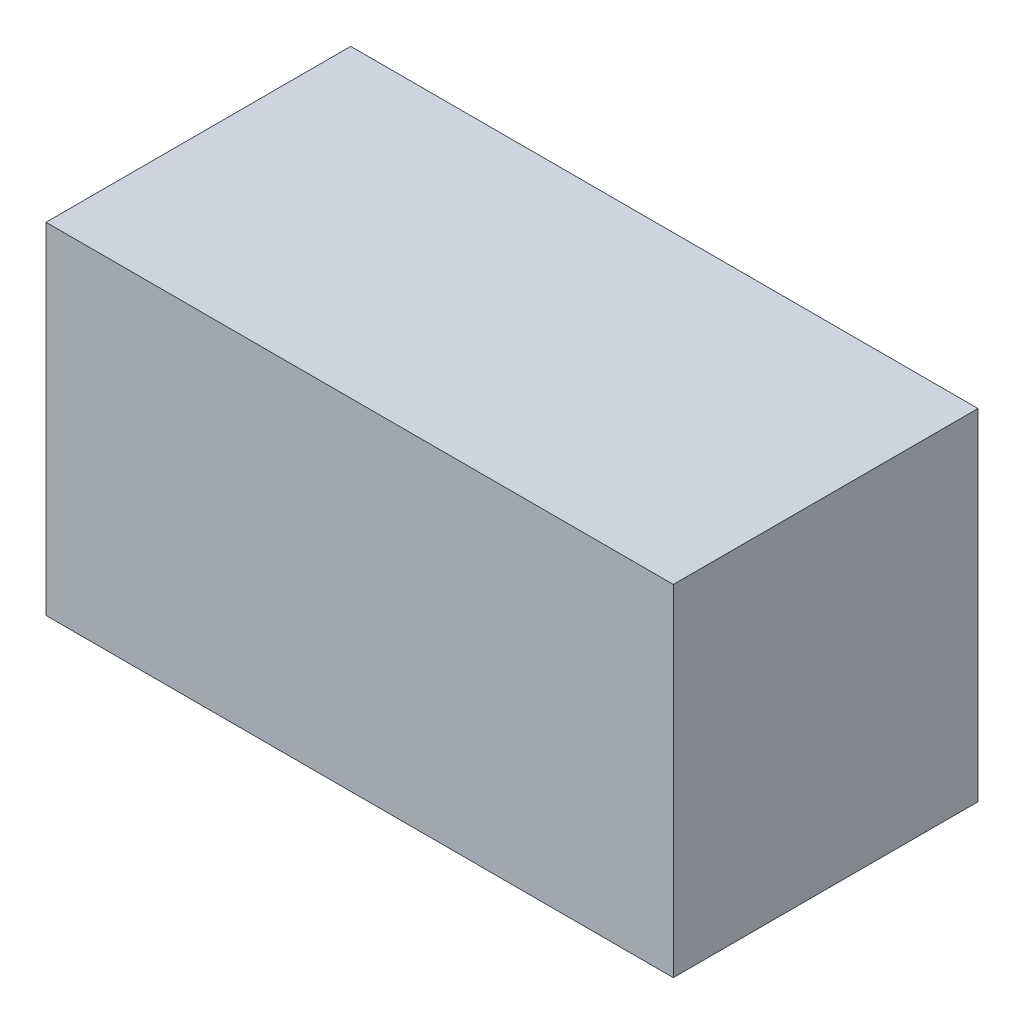
ISO-10303-21;
HEADER;
FILE_DESCRIPTION(('STEP AP214'),'2;1');
FILE_NAME('part.step','',(''),(''),'','','');
FILE_SCHEMA(('AUTOMOTIVE_DESIGN { 1 0 10303 214 1 1 1 1 }'));
ENDSEC;
DATA;
#1=APPLICATION_CONTEXT('core data for automotive mechanical design processes');
#2=APPLICATION_PROTOCOL_DEFINITION('international standard','automotive_design',2000,#1);
#3=PRODUCT_CONTEXT('',#1,'mechanical');
#4=PRODUCT('Part','Part','',(#3));
#5=PRODUCT_RELATED_PRODUCT_CATEGORY('part','',(#4));
#6=PRODUCT_DEFINITION_FORMATION('','',#4);
#7=PRODUCT_DEFINITION_CONTEXT('part definition',#1,'design');
#8=PRODUCT_DEFINITION('design','',#6,#7);
#9=PRODUCT_DEFINITION_SHAPE('','',#8);
#10=(LENGTH_UNIT() NAMED_UNIT(*) SI_UNIT(.MILLI.,.METRE.));
#11=(NAMED_UNIT(*) PLANE_ANGLE_UNIT() SI_UNIT($,.RADIAN.));
#12=(NAMED_UNIT(*) SI_UNIT($,.STERADIAN.) SOLID_ANGLE_UNIT());
#13=UNCERTAINTY_MEASURE_WITH_UNIT(LENGTH_MEASURE(1.E-05),#10,'distance_accuracy_value','');
#14=(GEOMETRIC_REPRESENTATION_CONTEXT(3) GLOBAL_UNCERTAINTY_ASSIGNED_CONTEXT((#13)) GLOBAL_UNIT_ASSIGNED_CONTEXT((#10,
#11,#12)) REPRESENTATION_CONTEXT('',''));
#15=CARTESIAN_POINT('',(0.,0.,0.));
#16=DIRECTION('',(0.,0.,1.));
#17=DIRECTION('',(1.,0.,0.));
#18=AXIS2_PLACEMENT_3D('',#15,#16,#17);
#19=CARTESIAN_POINT('',(-0.87499952,-0.47500032,0.));
#20=DIRECTION('',(0.,1.,0.));
#21=DIRECTION('',(1.,0.,0.));
#22=AXIS2_PLACEMENT_3D('',#19,#20,#21);
#23=PLANE('',#22);
#24=DIRECTION('',(1.,0.,0.));
#25=VECTOR('',#24,1.);
#26=CARTESIAN_POINT('',(-0.87499952,-0.47500032,0.));
#27=LINE('',#26,#25);
#28=CARTESIAN_POINT('',(-0.87499952,-0.47500032,0.));
#29=VERTEX_POINT('',#28);
#30=CARTESIAN_POINT('',(0.87499952,-0.47500032,0.));
#31=VERTEX_POINT('',#30);
#32=EDGE_CURVE('E10',#29,#31,#27,.T.);
#33=ORIENTED_EDGE('',*,*,#32,.T.);
#34=DIRECTION('',(0.,0.,1.));
#35=VECTOR('',#34,1.);
#36=CARTESIAN_POINT('',(0.87499952,-0.47500032,0.));
#37=LINE('',#36,#35);
#38=CARTESIAN_POINT('',(0.87499952,-0.47500032,0.85000084));
#39=VERTEX_POINT('',#38);
#40=EDGE_CURVE('E23',#31,#39,#37,.T.);
#41=ORIENTED_EDGE('',*,*,#40,.T.);
#42=DIRECTION('',(1.,0.,0.));
#43=VECTOR('',#42,1.);
#44=CARTESIAN_POINT('',(-0.87499952,-0.47500032,0.85000084));
#45=LINE('',#44,#43);
#46=CARTESIAN_POINT('',(-0.87499952,-0.47500032,0.85000084));
#47=VERTEX_POINT('',#46);
#48=EDGE_CURVE('E85',#47,#39,#45,.T.);
#49=ORIENTED_EDGE('',*,*,#48,.F.);
#50=DIRECTION('',(0.,0.,1.));
#51=VECTOR('',#50,1.);
#52=CARTESIAN_POINT('',(-0.87499952,-0.47500032,0.));
#53=LINE('',#52,#51);
#54=EDGE_CURVE('E36',#29,#47,#53,.T.);
#55=ORIENTED_EDGE('',*,*,#54,.F.);
#56=EDGE_LOOP('',(#33,#41,#49,#55));
#57=FACE_BOUND('',#56,.T.);
#58=ADVANCED_FACE('F16',(#57),#23,.F.);
#59=CARTESIAN_POINT('',(0.87499952,-0.47500032,0.));
#60=DIRECTION('',(-1.,0.,0.));
#61=DIRECTION('',(0.,1.,0.));
#62=AXIS2_PLACEMENT_3D('',#59,#60,#61);
#63=PLANE('',#62);
#64=DIRECTION('',(0.,1.,0.));
#65=VECTOR('',#64,1.);
#66=CARTESIAN_POINT('',(0.87499952,-0.47500032,0.));
#67=LINE('',#66,#65);
#68=CARTESIAN_POINT('',(0.87499952,0.47500032,0.));
#69=VERTEX_POINT('',#68);
#70=EDGE_CURVE('E30',#31,#69,#67,.T.);
#71=ORIENTED_EDGE('',*,*,#70,.T.);
#72=DIRECTION('',(0.,0.,1.));
#73=VECTOR('',#72,1.);
#74=CARTESIAN_POINT('',(0.87499952,0.47500032,0.));
#75=LINE('',#74,#73);
#76=CARTESIAN_POINT('',(0.87499952,0.47500032,0.85000084));
#77=VERTEX_POINT('',#76);
#78=EDGE_CURVE('E81',#69,#77,#75,.T.);
#79=ORIENTED_EDGE('',*,*,#78,.T.);
#80=DIRECTION('',(0.,1.,0.));
#81=VECTOR('',#80,1.);
#82=CARTESIAN_POINT('',(0.87499952,-0.47500032,0.85000084));
#83=LINE('',#82,#81);
#84=EDGE_CURVE('E61',#39,#77,#83,.T.);
#85=ORIENTED_EDGE('',*,*,#84,.F.);
#86=ORIENTED_EDGE('',*,*,#40,.F.);
#87=EDGE_LOOP('',(#71,#79,#85,#86));
#88=FACE_BOUND('',#87,.T.);
#89=ADVANCED_FACE('F89',(#88),#63,.F.);
#90=CARTESIAN_POINT('',(0.87499952,0.47500032,0.));
#91=DIRECTION('',(0.,-1.,0.));
#92=DIRECTION('',(-1.,0.,0.));
#93=AXIS2_PLACEMENT_3D('',#90,#91,#92);
#94=PLANE('',#93);
#95=DIRECTION('',(-1.,0.,0.));
#96=VECTOR('',#95,1.);
#97=CARTESIAN_POINT('',(0.87499952,0.47500032,0.));
#98=LINE('',#97,#96);
#99=CARTESIAN_POINT('',(-0.87499952,0.47500032,0.));
#100=VERTEX_POINT('',#99);
#101=EDGE_CURVE('E75',#69,#100,#98,.T.);
#102=ORIENTED_EDGE('',*,*,#101,.T.);
#103=DIRECTION('',(0.,0.,1.));
#104=VECTOR('',#103,1.);
#105=CARTESIAN_POINT('',(-0.87499952,0.47500032,0.));
#106=LINE('',#105,#104);
#107=CARTESIAN_POINT('',(-0.87499952,0.47500032,0.85000084));
#108=VERTEX_POINT('',#107);
#109=EDGE_CURVE('E66',#100,#108,#106,.T.);
#110=ORIENTED_EDGE('',*,*,#109,.T.);
#111=DIRECTION('',(-1.,0.,0.));
#112=VECTOR('',#111,1.);
#113=CARTESIAN_POINT('',(0.87499952,0.47500032,0.85000084));
#114=LINE('',#113,#112);
#115=EDGE_CURVE('E56',#77,#108,#114,.T.);
#116=ORIENTED_EDGE('',*,*,#115,.F.);
#117=ORIENTED_EDGE('',*,*,#78,.F.);
#118=EDGE_LOOP('',(#102,#110,#116,#117));
#119=FACE_BOUND('',#118,.T.);
#120=ADVANCED_FACE('F74',(#119),#94,.F.);
#121=CARTESIAN_POINT('',(-0.87499952,0.47500032,0.));
#122=DIRECTION('',(1.,0.,0.));
#123=DIRECTION('',(0.,-1.,0.));
#124=AXIS2_PLACEMENT_3D('',#121,#122,#123);
#125=PLANE('',#124);
#126=DIRECTION('',(0.,-1.,0.));
#127=VECTOR('',#126,1.);
#128=CARTESIAN_POINT('',(-0.87499952,0.47500032,0.));
#129=LINE('',#128,#127);
#130=EDGE_CURVE('E67',#100,#29,#129,.T.);
#131=ORIENTED_EDGE('',*,*,#130,.T.);
#132=ORIENTED_EDGE('',*,*,#54,.T.);
#133=DIRECTION('',(0.,-1.,0.));
#134=VECTOR('',#133,1.);
#135=CARTESIAN_POINT('',(-0.87499952,0.47500032,0.85000084));
#136=LINE('',#135,#134);
#137=EDGE_CURVE('E59',#108,#47,#136,.T.);
#138=ORIENTED_EDGE('',*,*,#137,.F.);
#139=ORIENTED_EDGE('',*,*,#109,.F.);
#140=EDGE_LOOP('',(#131,#132,#138,#139));
#141=FACE_BOUND('',#140,.T.);
#142=ADVANCED_FACE('F71',(#141),#125,.F.);
#143=CARTESIAN_POINT('',(-0.87499952,-0.47500032,0.));
#144=DIRECTION('',(0.,0.,-1.));
#145=DIRECTION('',(-1.,0.,0.));
#146=AXIS2_PLACEMENT_3D('',#143,#144,#145);
#147=PLANE('',#146);
#148=ORIENTED_EDGE('',*,*,#130,.F.);
#149=ORIENTED_EDGE('',*,*,#101,.F.);
#150=ORIENTED_EDGE('',*,*,#70,.F.);
#151=ORIENTED_EDGE('',*,*,#32,.F.);
#152=EDGE_LOOP('',(#148,#149,#150,#151));
#153=FACE_BOUND('',#152,.T.);
#154=ADVANCED_FACE('F90',(#153),#147,.T.);
#155=CARTESIAN_POINT('',(-0.87499952,-0.47500032,0.85000084));
#156=DIRECTION('',(0.,0.,-1.));
#157=DIRECTION('',(-1.,0.,0.));
#158=AXIS2_PLACEMENT_3D('',#155,#156,#157);
#159=PLANE('',#158);
#160=ORIENTED_EDGE('',*,*,#48,.T.);
#161=ORIENTED_EDGE('',*,*,#84,.T.);
#162=ORIENTED_EDGE('',*,*,#115,.T.);
#163=ORIENTED_EDGE('',*,*,#137,.T.);
#164=EDGE_LOOP('',(#160,#161,#162,#163));
#165=FACE_BOUND('',#164,.T.);
#166=ADVANCED_FACE('F58',(#165),#159,.F.);
#167=CLOSED_SHELL('',(#58,#89,#120,#142,#154,#166));
#168=MANIFOLD_SOLID_BREP('B1',#167);
#169=ADVANCED_BREP_SHAPE_REPRESENTATION('',(#18,#168),#14);
#170=SHAPE_DEFINITION_REPRESENTATION(#9,#169);
ENDSEC;
END-ISO-10303-21;
